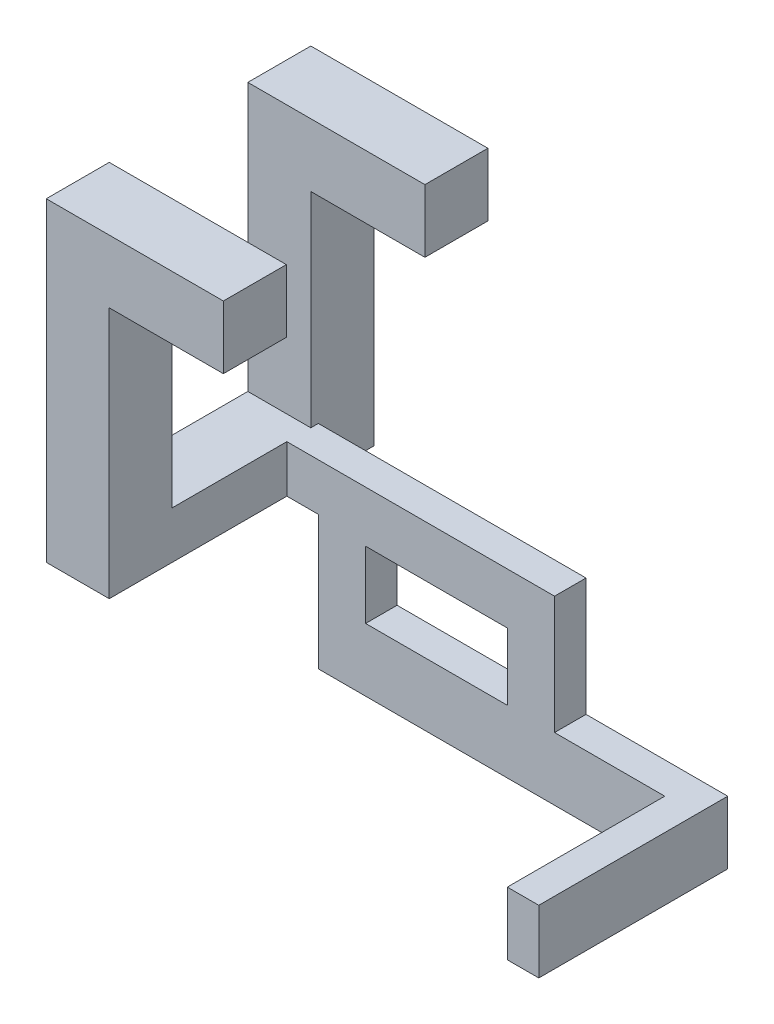
ISO-10303-21;
HEADER;
FILE_DESCRIPTION(('STEP AP214'),'2;1');
FILE_NAME('part.step','',(''),(''),'','','');
FILE_SCHEMA(('AUTOMOTIVE_DESIGN { 1 0 10303 214 1 1 1 1 }'));
ENDSEC;
DATA;
#1=APPLICATION_CONTEXT('core data for automotive mechanical design processes');
#2=APPLICATION_PROTOCOL_DEFINITION('international standard','automotive_design',2000,#1);
#3=PRODUCT_CONTEXT('',#1,'mechanical');
#4=PRODUCT('Part','Part','',(#3));
#5=PRODUCT_RELATED_PRODUCT_CATEGORY('part','',(#4));
#6=PRODUCT_DEFINITION_FORMATION('','',#4);
#7=PRODUCT_DEFINITION_CONTEXT('part definition',#1,'design');
#8=PRODUCT_DEFINITION('design','',#6,#7);
#9=PRODUCT_DEFINITION_SHAPE('','',#8);
#10=(LENGTH_UNIT() NAMED_UNIT(*) SI_UNIT(.MILLI.,.METRE.));
#11=(NAMED_UNIT(*) PLANE_ANGLE_UNIT() SI_UNIT($,.RADIAN.));
#12=(NAMED_UNIT(*) SI_UNIT($,.STERADIAN.) SOLID_ANGLE_UNIT());
#13=UNCERTAINTY_MEASURE_WITH_UNIT(LENGTH_MEASURE(1.E-05),#10,'distance_accuracy_value','');
#14=(GEOMETRIC_REPRESENTATION_CONTEXT(3) GLOBAL_UNCERTAINTY_ASSIGNED_CONTEXT((#13)) GLOBAL_UNIT_ASSIGNED_CONTEXT((#10,
#11,#12)) REPRESENTATION_CONTEXT('',''));
#15=CARTESIAN_POINT('',(0.,0.,0.));
#16=DIRECTION('',(0.,0.,1.));
#17=DIRECTION('',(1.,0.,0.));
#18=AXIS2_PLACEMENT_3D('',#15,#16,#17);
#19=CARTESIAN_POINT('',(-24.1300000000002,57.785,23.5700000000001));
#20=DIRECTION('',(0.,0.,-1.));
#21=DIRECTION('',(-0.999999999999999,0.,0.));
#22=AXIS2_PLACEMENT_3D('',#19,#20,#21);
#23=PLANE('',#22);
#24=DIRECTION('',(-0.999999999999999,0.,0.));
#25=VECTOR('',#24,1.);
#26=CARTESIAN_POINT('',(-29.2100000000002,14.605,23.5700000000001));
#27=LINE('',#26,#25);
#28=CARTESIAN_POINT('',(-24.1300000000001,14.6049999999999,23.5700000000001));
#29=VERTEX_POINT('',#28);
#30=CARTESIAN_POINT('',(-34.2900000000002,14.605,23.5700000000001));
#31=VERTEX_POINT('',#30);
#32=EDGE_CURVE('E55',#29,#31,#27,.T.);
#33=ORIENTED_EDGE('',*,*,#32,.T.);
#34=DIRECTION('',(0.,-1.,0.));
#35=VECTOR('',#34,1.);
#36=CARTESIAN_POINT('',(-34.29,57.785,23.5700000000001));
#37=LINE('',#36,#35);
#38=CARTESIAN_POINT('',(-34.29,57.785,23.5700000000001));
#39=VERTEX_POINT('',#38);
#40=EDGE_CURVE('E352',#39,#31,#37,.T.);
#41=ORIENTED_EDGE('',*,*,#40,.F.);
#42=DIRECTION('',(0.999999999999999,0.,0.));
#43=VECTOR('',#42,1.);
#44=CARTESIAN_POINT('',(-24.1300000000002,57.785,23.5700000000001));
#45=LINE('',#44,#43);
#46=CARTESIAN_POINT('',(-5.72109422320011,57.785,23.5700000000001));
#47=VERTEX_POINT('',#46);
#48=EDGE_CURVE('E343',#39,#47,#45,.T.);
#49=ORIENTED_EDGE('',*,*,#48,.T.);
#50=DIRECTION('',(0.,-1.,0.));
#51=VECTOR('',#50,1.);
#52=CARTESIAN_POINT('',(-5.72109422320011,57.785,23.5700000000001));
#53=LINE('',#52,#51);
#54=CARTESIAN_POINT('',(-5.72109422320013,47.625,23.5700000000001));
#55=VERTEX_POINT('',#54);
#56=EDGE_CURVE('E287',#47,#55,#53,.T.);
#57=ORIENTED_EDGE('',*,*,#56,.T.);
#58=DIRECTION('',(-0.999999999999999,0.,0.));
#59=VECTOR('',#58,1.);
#60=CARTESIAN_POINT('',(8.64731557051054,47.625,23.5700000000001));
#61=LINE('',#60,#59);
#62=CARTESIAN_POINT('',(-24.13,47.625,23.5700000000001));
#63=VERTEX_POINT('',#62);
#64=EDGE_CURVE('E300',#55,#63,#61,.T.);
#65=ORIENTED_EDGE('',*,*,#64,.T.);
#66=DIRECTION('',(0.,-1.,0.));
#67=VECTOR('',#66,1.);
#68=CARTESIAN_POINT('',(-24.1300000000002,57.785,23.5700000000001));
#69=LINE('',#68,#67);
#70=EDGE_CURVE('E349',#63,#29,#69,.T.);
#71=ORIENTED_EDGE('',*,*,#70,.T.);
#72=EDGE_LOOP('',(#33,#41,#49,#57,#65,#71));
#73=FACE_BOUND('',#72,.T.);
#74=ADVANCED_FACE('F40',(#73),#23,.T.);
#75=CARTESIAN_POINT('',(-24.13,57.785,1.218));
#76=DIRECTION('',(0.,0.,1.));
#77=DIRECTION('',(0.,-1.,0.));
#78=AXIS2_PLACEMENT_3D('',#75,#76,#77);
#79=PLANE('',#78);
#80=DIRECTION('',(0.,-1.,0.));
#81=VECTOR('',#80,1.);
#82=CARTESIAN_POINT('',(-34.2900000000001,57.785,1.21799999999999));
#83=LINE('',#82,#81);
#84=CARTESIAN_POINT('',(-34.2900000000001,57.785,1.21799999999999));
#85=VERTEX_POINT('',#84);
#86=CARTESIAN_POINT('',(-34.29,14.605,1.21799999999999));
#87=VERTEX_POINT('',#86);
#88=EDGE_CURVE('E311',#85,#87,#83,.T.);
#89=ORIENTED_EDGE('',*,*,#88,.T.);
#90=DIRECTION('',(-0.999999999999999,0.,0.));
#91=VECTOR('',#90,1.);
#92=CARTESIAN_POINT('',(19.05,14.605,1.218));
#93=LINE('',#92,#91);
#94=CARTESIAN_POINT('',(-24.1300000000002,14.605,1.21799999999999));
#95=VERTEX_POINT('',#94);
#96=EDGE_CURVE('E63',#95,#87,#93,.T.);
#97=ORIENTED_EDGE('',*,*,#96,.F.);
#98=DIRECTION('',(0.,-1.,0.));
#99=VECTOR('',#98,1.);
#100=CARTESIAN_POINT('',(-24.13,57.785,1.218));
#101=LINE('',#100,#99);
#102=CARTESIAN_POINT('',(-24.13,47.625,1.21799999999999));
#103=VERTEX_POINT('',#102);
#104=EDGE_CURVE('E308',#103,#95,#101,.T.);
#105=ORIENTED_EDGE('',*,*,#104,.F.);
#106=DIRECTION('',(-0.999999999999999,0.,0.));
#107=VECTOR('',#106,1.);
#108=CARTESIAN_POINT('',(8.64731557051068,47.625,1.21799999999999));
#109=LINE('',#108,#107);
#110=CARTESIAN_POINT('',(-5.7210942232,47.625,1.21799999999999));
#111=VERTEX_POINT('',#110);
#112=EDGE_CURVE('E269',#111,#103,#109,.T.);
#113=ORIENTED_EDGE('',*,*,#112,.F.);
#114=DIRECTION('',(0.,1.,0.));
#115=VECTOR('',#114,1.);
#116=CARTESIAN_POINT('',(-5.7210942232,57.785,1.21799999999999));
#117=LINE('',#116,#115);
#118=CARTESIAN_POINT('',(-5.7210942232,57.785,1.21799999999999));
#119=VERTEX_POINT('',#118);
#120=EDGE_CURVE('E265',#111,#119,#117,.T.);
#121=ORIENTED_EDGE('',*,*,#120,.T.);
#122=DIRECTION('',(-0.999999999999999,0.,0.));
#123=VECTOR('',#122,1.);
#124=CARTESIAN_POINT('',(-24.13,57.785,1.218));
#125=LINE('',#124,#123);
#126=EDGE_CURVE('E321',#119,#85,#125,.T.);
#127=ORIENTED_EDGE('',*,*,#126,.T.);
#128=EDGE_LOOP('',(#89,#97,#105,#113,#121,#127));
#129=FACE_BOUND('',#128,.T.);
#130=ADVANCED_FACE('F441',(#129),#79,.T.);
#131=CARTESIAN_POINT('',(-1.38777878078145E-13,0.,5.08));
#132=DIRECTION('',(0.,0.,1.));
#133=DIRECTION('',(0.999999999999999,0.,0.));
#134=AXIS2_PLACEMENT_3D('',#131,#132,#133);
#135=PLANE('',#134);
#136=DIRECTION('',(0.,1.,0.));
#137=VECTOR('',#136,1.);
#138=CARTESIAN_POINT('',(11.4299999999999,-6.34999999999999,5.08));
#139=LINE('',#138,#137);
#140=CARTESIAN_POINT('',(11.4299999999999,-4.44499999999995,5.08));
#141=VERTEX_POINT('',#140);
#142=CARTESIAN_POINT('',(11.4299999999999,6.35000000000005,5.08));
#143=VERTEX_POINT('',#142);
#144=EDGE_CURVE('E375',#141,#143,#139,.T.);
#145=ORIENTED_EDGE('',*,*,#144,.F.);
#146=DIRECTION('',(0.999999999999999,0.,0.));
#147=VECTOR('',#146,1.);
#148=CARTESIAN_POINT('',(-30.4092253256992,-4.445,5.08));
#149=LINE('',#148,#147);
#150=CARTESIAN_POINT('',(-11.4300000000001,-4.44500000000009,5.08));
#151=VERTEX_POINT('',#150);
#152=EDGE_CURVE('E257',#151,#141,#149,.T.);
#153=ORIENTED_EDGE('',*,*,#152,.F.);
#154=DIRECTION('',(0.,-1.,0.));
#155=VECTOR('',#154,1.);
#156=CARTESIAN_POINT('',(-11.4300000000001,-6.34999999999999,5.08));
#157=LINE('',#156,#155);
#158=CARTESIAN_POINT('',(-11.4300000000001,6.34999999999988,5.08));
#159=VERTEX_POINT('',#158);
#160=EDGE_CURVE('E379',#159,#151,#157,.T.);
#161=ORIENTED_EDGE('',*,*,#160,.F.);
#162=DIRECTION('',(-0.999999999999999,0.,0.));
#163=VECTOR('',#162,1.);
#164=CARTESIAN_POINT('',(-11.4300000000001,6.34999999999988,5.08));
#165=LINE('',#164,#163);
#166=EDGE_CURVE('E387',#143,#159,#165,.T.);
#167=ORIENTED_EDGE('',*,*,#166,.F.);
#168=EDGE_LOOP('',(#145,#153,#161,#167));
#169=FACE_BOUND('',#168,.T.);
#170=DIRECTION('',(-0.999999999999999,0.,0.));
#171=VECTOR('',#170,1.);
#172=CARTESIAN_POINT('',(19.0499999999999,-14.605,5.08000000000002));
#173=LINE('',#172,#171);
#174=CARTESIAN_POINT('',(36.8299999999999,-14.6050000000001,5.08));
#175=VERTEX_POINT('',#174);
#176=CARTESIAN_POINT('',(-19.05,-14.605,5.08));
#177=VERTEX_POINT('',#176);
#178=EDGE_CURVE('E403',#175,#177,#173,.T.);
#179=ORIENTED_EDGE('',*,*,#178,.F.);
#180=DIRECTION('',(0.,-1.,0.));
#181=VECTOR('',#180,1.);
#182=CARTESIAN_POINT('',(36.83,-4.44499999999998,5.07999999999999));
#183=LINE('',#182,#181);
#184=CARTESIAN_POINT('',(36.83,-4.44499999999998,5.07999999999999));
#185=VERTEX_POINT('',#184);
#186=EDGE_CURVE('E240',#185,#175,#183,.T.);
#187=ORIENTED_EDGE('',*,*,#186,.F.);
#188=CARTESIAN_POINT('',(19.0499999999998,-4.445,5.08));
#189=VERTEX_POINT('',#188);
#190=EDGE_CURVE('E255',#189,#185,#149,.T.);
#191=ORIENTED_EDGE('',*,*,#190,.F.);
#192=DIRECTION('',(0.,1.,0.));
#193=VECTOR('',#192,1.);
#194=CARTESIAN_POINT('',(19.0499999999999,-14.605,5.08000000000002));
#195=LINE('',#194,#193);
#196=CARTESIAN_POINT('',(19.0499999999997,14.605,5.08));
#197=VERTEX_POINT('',#196);
#198=EDGE_CURVE('E396',#189,#197,#195,.T.);
#199=ORIENTED_EDGE('',*,*,#198,.T.);
#200=DIRECTION('',(-0.999999999999999,0.,0.));
#201=VECTOR('',#200,1.);
#202=CARTESIAN_POINT('',(19.0499999999997,14.605,5.08));
#203=LINE('',#202,#201);
#204=CARTESIAN_POINT('',(-24.13,14.605,5.08));
#205=VERTEX_POINT('',#204);
#206=EDGE_CURVE('E398',#197,#205,#203,.T.);
#207=ORIENTED_EDGE('',*,*,#206,.T.);
#208=DIRECTION('',(0.,1.,0.));
#209=VECTOR('',#208,1.);
#210=CARTESIAN_POINT('',(-24.13,14.605,5.08));
#211=LINE('',#210,#209);
#212=CARTESIAN_POINT('',(-24.1300000000001,6.98499999999991,5.08));
#213=VERTEX_POINT('',#212);
#214=EDGE_CURVE('E357',#213,#205,#211,.T.);
#215=ORIENTED_EDGE('',*,*,#214,.F.);
#216=DIRECTION('',(0.999999999999999,0.,0.));
#217=VECTOR('',#216,1.);
#218=CARTESIAN_POINT('',(-29.2100000000002,6.98499999999999,5.08));
#219=LINE('',#218,#217);
#220=CARTESIAN_POINT('',(-19.05,6.98499999999999,5.08));
#221=VERTEX_POINT('',#220);
#222=EDGE_CURVE('E369',#213,#221,#219,.T.);
#223=ORIENTED_EDGE('',*,*,#222,.T.);
#224=DIRECTION('',(0.,1.,0.));
#225=VECTOR('',#224,1.);
#226=CARTESIAN_POINT('',(-19.05,-14.605,5.08));
#227=LINE('',#226,#225);
#228=EDGE_CURVE('E401',#177,#221,#227,.T.);
#229=ORIENTED_EDGE('',*,*,#228,.F.);
#230=EDGE_LOOP('',(#179,#187,#191,#199,#207,#215,#223,#229));
#231=FACE_BOUND('',#230,.T.);
#232=ADVANCED_FACE('F461',(#169,#231),#135,.T.);
#233=CARTESIAN_POINT('',(-24.13,57.785,1.218));
#234=DIRECTION('',(0.999999999999999,0.,0.));
#235=DIRECTION('',(0.,0.,-1.));
#236=AXIS2_PLACEMENT_3D('',#233,#234,#235);
#237=PLANE('',#236);
#238=DIRECTION('',(0.,-1.,0.));
#239=VECTOR('',#238,1.);
#240=CARTESIAN_POINT('',(-24.1299999999999,57.7849999999999,-8.94200000000005));
#241=LINE('',#240,#239);
#242=CARTESIAN_POINT('',(-24.1300000000001,47.625,-8.94200000000002));
#243=VERTEX_POINT('',#242);
#244=CARTESIAN_POINT('',(-24.1300000000001,6.98499999999988,-8.94200000000004));
#245=VERTEX_POINT('',#244);
#246=EDGE_CURVE('E297',#243,#245,#241,.T.);
#247=ORIENTED_EDGE('',*,*,#246,.F.);
#248=DIRECTION('',(0.,0.,-1.));
#249=VECTOR('',#248,1.);
#250=CARTESIAN_POINT('',(-24.13,47.625,1.21799999999998));
#251=LINE('',#250,#249);
#252=EDGE_CURVE('E276',#103,#243,#251,.T.);
#253=ORIENTED_EDGE('',*,*,#252,.F.);
#254=ORIENTED_EDGE('',*,*,#104,.T.);
#255=DIRECTION('',(0.,0.,1.));
#256=VECTOR('',#255,1.);
#257=CARTESIAN_POINT('',(-24.13,14.605,5.08));
#258=LINE('',#257,#256);
#259=CARTESIAN_POINT('',(-24.13,14.605,0.));
#260=VERTEX_POINT('',#259);
#261=EDGE_CURVE('E333',#260,#95,#258,.T.);
#262=ORIENTED_EDGE('',*,*,#261,.F.);
#263=DIRECTION('',(0.,1.,0.));
#264=VECTOR('',#263,1.);
#265=CARTESIAN_POINT('',(-24.13,0.,0.));
#266=LINE('',#265,#264);
#267=CARTESIAN_POINT('',(-24.1300000000002,6.98499999999991,0.));
#268=VERTEX_POINT('',#267);
#269=EDGE_CURVE('E331',#268,#260,#266,.T.);
#270=ORIENTED_EDGE('',*,*,#269,.F.);
#271=DIRECTION('',(0.,0.,1.));
#272=VECTOR('',#271,1.);
#273=CARTESIAN_POINT('',(-24.13,6.98499999999985,1.218));
#274=LINE('',#273,#272);
#275=EDGE_CURVE('E320',#245,#268,#274,.T.);
#276=ORIENTED_EDGE('',*,*,#275,.F.);
#277=EDGE_LOOP('',(#247,#253,#254,#262,#270,#276));
#278=FACE_BOUND('',#277,.T.);
#279=ADVANCED_FACE('F428',(#278),#237,.T.);
#280=CARTESIAN_POINT('',(-24.13,14.605,32.7281002396786));
#281=DIRECTION('',(-0.999999999999999,0.,0.));
#282=DIRECTION('',(0.,0.,1.));
#283=AXIS2_PLACEMENT_3D('',#280,#281,#282);
#284=PLANE('',#283);
#285=DIRECTION('',(0.,0.,-1.));
#286=VECTOR('',#285,1.);
#287=CARTESIAN_POINT('',(-24.13,47.625,33.7300000000001));
#288=LINE('',#287,#286);
#289=CARTESIAN_POINT('',(-24.13,47.625,33.7300000000001));
#290=VERTEX_POINT('',#289);
#291=EDGE_CURVE('E279',#290,#63,#288,.T.);
#292=ORIENTED_EDGE('',*,*,#291,.F.);
#293=DIRECTION('',(0.,-1.,0.));
#294=VECTOR('',#293,1.);
#295=CARTESIAN_POINT('',(-24.13,57.785,33.7300000000001));
#296=LINE('',#295,#294);
#297=CARTESIAN_POINT('',(-24.1300000000002,6.98500000000002,33.7300000000001));
#298=VERTEX_POINT('',#297);
#299=EDGE_CURVE('E345',#290,#298,#296,.T.);
#300=ORIENTED_EDGE('',*,*,#299,.T.);
#301=DIRECTION('',(0.,0.,-1.));
#302=VECTOR('',#301,1.);
#303=CARTESIAN_POINT('',(-24.1300000000001,6.98499999999999,32.7281002396786));
#304=LINE('',#303,#302);
#305=EDGE_CURVE('E351',#298,#213,#304,.T.);
#306=ORIENTED_EDGE('',*,*,#305,.T.);
#307=ORIENTED_EDGE('',*,*,#214,.T.);
#308=DIRECTION('',(0.,0.,-1.));
#309=VECTOR('',#308,1.);
#310=CARTESIAN_POINT('',(-24.13,14.605,32.7281002396786));
#311=LINE('',#310,#309);
#312=EDGE_CURVE('E360',#29,#205,#311,.T.);
#313=ORIENTED_EDGE('',*,*,#312,.F.);
#314=ORIENTED_EDGE('',*,*,#70,.F.);
#315=EDGE_LOOP('',(#292,#300,#306,#307,#313,#314));
#316=FACE_BOUND('',#315,.T.);
#317=ADVANCED_FACE('F456',(#316),#284,.F.);
#318=CARTESIAN_POINT('',(19.0499999999999,-14.605,5.08000000000002));
#319=DIRECTION('',(-0.999999999999999,0.,0.));
#320=DIRECTION('',(0.,0.,1.));
#321=AXIS2_PLACEMENT_3D('',#318,#319,#320);
#322=PLANE('',#321);
#323=ORIENTED_EDGE('',*,*,#198,.F.);
#324=DIRECTION('',(0.,0.,-1.));
#325=VECTOR('',#324,1.);
#326=CARTESIAN_POINT('',(19.0499999999998,-4.445,5.08));
#327=LINE('',#326,#325);
#328=CARTESIAN_POINT('',(19.0499999999999,-4.445,0.));
#329=VERTEX_POINT('',#328);
#330=EDGE_CURVE('E262',#189,#329,#327,.T.);
#331=ORIENTED_EDGE('',*,*,#330,.T.);
#332=DIRECTION('',(0.,1.,0.));
#333=VECTOR('',#332,1.);
#334=CARTESIAN_POINT('',(19.0499999999998,-14.605,0.));
#335=LINE('',#334,#333);
#336=CARTESIAN_POINT('',(19.05,14.605,0.));
#337=VERTEX_POINT('',#336);
#338=EDGE_CURVE('E393',#329,#337,#335,.T.);
#339=ORIENTED_EDGE('',*,*,#338,.T.);
#340=DIRECTION('',(0.,0.,-1.));
#341=VECTOR('',#340,1.);
#342=CARTESIAN_POINT('',(19.0499999999997,14.605,5.08));
#343=LINE('',#342,#341);
#344=EDGE_CURVE('E48',#197,#337,#343,.T.);
#345=ORIENTED_EDGE('',*,*,#344,.F.);
#346=EDGE_LOOP('',(#323,#331,#339,#345));
#347=FACE_BOUND('',#346,.T.);
#348=ADVANCED_FACE('F42',(#347),#322,.F.);
#349=CARTESIAN_POINT('',(19.0499999999997,14.605,5.08));
#350=DIRECTION('',(0.,-1.,0.));
#351=DIRECTION('',(0.999999999999999,0.,0.));
#352=AXIS2_PLACEMENT_3D('',#349,#350,#351);
#353=PLANE('',#352);
#354=DIRECTION('',(-0.999999999999999,0.,0.));
#355=VECTOR('',#354,1.);
#356=CARTESIAN_POINT('',(19.05,14.605,0.));
#357=LINE('',#356,#355);
#358=EDGE_CURVE('E407',#337,#260,#357,.T.);
#359=ORIENTED_EDGE('',*,*,#358,.T.);
#360=ORIENTED_EDGE('',*,*,#261,.T.);
#361=ORIENTED_EDGE('',*,*,#96,.T.);
#362=DIRECTION('',(0.,0.,-1.));
#363=VECTOR('',#362,1.);
#364=CARTESIAN_POINT('',(-34.29,14.605,1.21799999999999));
#365=LINE('',#364,#363);
#366=EDGE_CURVE('E242',#31,#87,#365,.T.);
#367=ORIENTED_EDGE('',*,*,#366,.F.);
#368=ORIENTED_EDGE('',*,*,#32,.F.);
#369=ORIENTED_EDGE('',*,*,#312,.T.);
#370=ORIENTED_EDGE('',*,*,#206,.F.);
#371=ORIENTED_EDGE('',*,*,#344,.T.);
#372=EDGE_LOOP('',(#359,#360,#361,#367,#368,#369,#370,#371));
#373=FACE_BOUND('',#372,.T.);
#374=ADVANCED_FACE('F417',(#373),#353,.F.);
#375=CARTESIAN_POINT('',(-19.05,-14.605,5.08));
#376=DIRECTION('',(-0.999999999999999,0.,0.));
#377=DIRECTION('',(0.,0.,1.));
#378=AXIS2_PLACEMENT_3D('',#375,#376,#377);
#379=PLANE('',#378);
#380=DIRECTION('',(0.,0.,1.));
#381=VECTOR('',#380,1.);
#382=CARTESIAN_POINT('',(-19.05,6.98499999999999,5.08));
#383=LINE('',#382,#381);
#384=CARTESIAN_POINT('',(-19.0500000000001,6.98499999999999,0.));
#385=VERTEX_POINT('',#384);
#386=EDGE_CURVE('E362',#385,#221,#383,.T.);
#387=ORIENTED_EDGE('',*,*,#386,.F.);
#388=DIRECTION('',(0.,1.,0.));
#389=VECTOR('',#388,1.);
#390=CARTESIAN_POINT('',(-19.0500000000001,-14.605,0.));
#391=LINE('',#390,#389);
#392=CARTESIAN_POINT('',(-19.0500000000001,-14.605,0.));
#393=VERTEX_POINT('',#392);
#394=EDGE_CURVE('E410',#393,#385,#391,.T.);
#395=ORIENTED_EDGE('',*,*,#394,.F.);
#396=DIRECTION('',(0.,0.,-1.));
#397=VECTOR('',#396,1.);
#398=CARTESIAN_POINT('',(-19.05,-14.605,5.08));
#399=LINE('',#398,#397);
#400=EDGE_CURVE('E405',#177,#393,#399,.T.);
#401=ORIENTED_EDGE('',*,*,#400,.F.);
#402=ORIENTED_EDGE('',*,*,#228,.T.);
#403=EDGE_LOOP('',(#387,#395,#401,#402));
#404=FACE_BOUND('',#403,.T.);
#405=ADVANCED_FACE('F466',(#404),#379,.T.);
#406=CARTESIAN_POINT('',(19.0499999999999,-14.605,5.08000000000002));
#407=DIRECTION('',(0.,-1.,0.));
#408=DIRECTION('',(0.999999999999999,0.,0.));
#409=AXIS2_PLACEMENT_3D('',#406,#407,#408);
#410=PLANE('',#409);
#411=DIRECTION('',(-0.999999999999999,0.,0.));
#412=VECTOR('',#411,1.);
#413=CARTESIAN_POINT('',(19.0499999999998,-14.605,0.));
#414=LINE('',#413,#412);
#415=CARTESIAN_POINT('',(41.9099999999998,-14.6050000000001,0.));
#416=VERTEX_POINT('',#415);
#417=EDGE_CURVE('E399',#416,#393,#414,.T.);
#418=ORIENTED_EDGE('',*,*,#417,.F.);
#419=DIRECTION('',(0.,0.,-1.));
#420=VECTOR('',#419,1.);
#421=CARTESIAN_POINT('',(41.9099999999999,-14.605,5.08));
#422=LINE('',#421,#420);
#423=CARTESIAN_POINT('',(41.91,-14.605,30.4800000000001));
#424=VERTEX_POINT('',#423);
#425=EDGE_CURVE('E252',#424,#416,#422,.T.);
#426=ORIENTED_EDGE('',*,*,#425,.F.);
#427=DIRECTION('',(0.999999999999999,0.,0.));
#428=VECTOR('',#427,1.);
#429=CARTESIAN_POINT('',(41.91,-14.605,30.4800000000001));
#430=LINE('',#429,#428);
#431=CARTESIAN_POINT('',(36.8299999999999,-14.605,30.4800000000001));
#432=VERTEX_POINT('',#431);
#433=EDGE_CURVE('E239',#432,#424,#430,.T.);
#434=ORIENTED_EDGE('',*,*,#433,.F.);
#435=DIRECTION('',(0.,0.,-1.));
#436=VECTOR('',#435,1.);
#437=CARTESIAN_POINT('',(36.8299999999999,-14.605,30.4800000000001));
#438=LINE('',#437,#436);
#439=EDGE_CURVE('E247',#432,#175,#438,.T.);
#440=ORIENTED_EDGE('',*,*,#439,.T.);
#441=ORIENTED_EDGE('',*,*,#178,.T.);
#442=ORIENTED_EDGE('',*,*,#400,.T.);
#443=EDGE_LOOP('',(#418,#426,#434,#440,#441,#442));
#444=FACE_BOUND('',#443,.T.);
#445=ADVANCED_FACE('F470',(#444),#410,.T.);
#446=CARTESIAN_POINT('',(0.,0.,0.));
#447=DIRECTION('',(0.,0.,1.));
#448=DIRECTION('',(0.999999999999999,0.,0.));
#449=AXIS2_PLACEMENT_3D('',#446,#447,#448);
#450=PLANE('',#449);
#451=DIRECTION('',(0.999999999999999,0.,0.));
#452=VECTOR('',#451,1.);
#453=CARTESIAN_POINT('',(-30.4092253256989,-4.44499999999998,0.));
#454=LINE('',#453,#452);
#455=CARTESIAN_POINT('',(-11.4300000000001,-4.445,0.));
#456=VERTEX_POINT('',#455);
#457=CARTESIAN_POINT('',(11.4299999999999,-4.445,0.));
#458=VERTEX_POINT('',#457);
#459=EDGE_CURVE('E258',#456,#458,#454,.T.);
#460=ORIENTED_EDGE('',*,*,#459,.T.);
#461=DIRECTION('',(0.,1.,0.));
#462=VECTOR('',#461,1.);
#463=CARTESIAN_POINT('',(11.4299999999999,-6.35000000000008,0.));
#464=LINE('',#463,#462);
#465=CARTESIAN_POINT('',(11.4299999999999,6.34999999999999,0.));
#466=VERTEX_POINT('',#465);
#467=EDGE_CURVE('E376',#458,#466,#464,.T.);
#468=ORIENTED_EDGE('',*,*,#467,.T.);
#469=DIRECTION('',(-0.999999999999999,0.,0.));
#470=VECTOR('',#469,1.);
#471=CARTESIAN_POINT('',(-11.4300000000001,6.34999999999999,0.));
#472=LINE('',#471,#470);
#473=CARTESIAN_POINT('',(-11.4300000000001,6.34999999999999,0.));
#474=VERTEX_POINT('',#473);
#475=EDGE_CURVE('E378',#466,#474,#472,.T.);
#476=ORIENTED_EDGE('',*,*,#475,.T.);
#477=DIRECTION('',(0.,-1.,0.));
#478=VECTOR('',#477,1.);
#479=CARTESIAN_POINT('',(-11.4300000000001,-6.34999999999999,0.));
#480=LINE('',#479,#478);
#481=EDGE_CURVE('E382',#474,#456,#480,.T.);
#482=ORIENTED_EDGE('',*,*,#481,.T.);
#483=EDGE_LOOP('',(#460,#468,#476,#482));
#484=FACE_BOUND('',#483,.T.);
#485=ORIENTED_EDGE('',*,*,#338,.F.);
#486=CARTESIAN_POINT('',(41.9099999999999,-4.445,0.));
#487=VERTEX_POINT('',#486);
#488=EDGE_CURVE('E224',#329,#487,#454,.T.);
#489=ORIENTED_EDGE('',*,*,#488,.T.);
#490=DIRECTION('',(0.,1.,0.));
#491=VECTOR('',#490,1.);
#492=CARTESIAN_POINT('',(41.9099999999999,-4.445,0.));
#493=LINE('',#492,#491);
#494=EDGE_CURVE('E222',#416,#487,#493,.T.);
#495=ORIENTED_EDGE('',*,*,#494,.F.);
#496=ORIENTED_EDGE('',*,*,#417,.T.);
#497=ORIENTED_EDGE('',*,*,#394,.T.);
#498=DIRECTION('',(0.999999999999999,0.,0.));
#499=VECTOR('',#498,1.);
#500=CARTESIAN_POINT('',(-29.21,6.98499999999999,0.));
#501=LINE('',#500,#499);
#502=EDGE_CURVE('E372',#268,#385,#501,.T.);
#503=ORIENTED_EDGE('',*,*,#502,.F.);
#504=ORIENTED_EDGE('',*,*,#269,.T.);
#505=ORIENTED_EDGE('',*,*,#358,.F.);
#506=EDGE_LOOP('',(#485,#489,#495,#496,#497,#503,#504,#505));
#507=FACE_BOUND('',#506,.T.);
#508=ADVANCED_FACE('F424',(#484,#507),#450,.F.);
#509=CARTESIAN_POINT('',(11.4299999999999,-6.35000000000008,0.));
#510=DIRECTION('',(0.999999999999999,0.,0.));
#511=DIRECTION('',(0.,0.,-1.));
#512=AXIS2_PLACEMENT_3D('',#509,#510,#511);
#513=PLANE('',#512);
#514=ORIENTED_EDGE('',*,*,#467,.F.);
#515=DIRECTION('',(0.,0.,1.));
#516=VECTOR('',#515,1.);
#517=CARTESIAN_POINT('',(11.4299999999999,-4.445,0.));
#518=LINE('',#517,#516);
#519=EDGE_CURVE('E260',#458,#141,#518,.T.);
#520=ORIENTED_EDGE('',*,*,#519,.T.);
#521=ORIENTED_EDGE('',*,*,#144,.T.);
#522=DIRECTION('',(0.,0.,1.));
#523=VECTOR('',#522,1.);
#524=CARTESIAN_POINT('',(11.4299999999999,6.34999999999999,0.));
#525=LINE('',#524,#523);
#526=EDGE_CURVE('E385',#466,#143,#525,.T.);
#527=ORIENTED_EDGE('',*,*,#526,.F.);
#528=EDGE_LOOP('',(#514,#520,#521,#527));
#529=FACE_BOUND('',#528,.T.);
#530=ADVANCED_FACE('F506',(#529),#513,.F.);
#531=CARTESIAN_POINT('',(-11.4300000000001,-6.34999999999999,0.));
#532=DIRECTION('',(-0.999999999999999,0.,0.));
#533=DIRECTION('',(0.,0.,1.));
#534=AXIS2_PLACEMENT_3D('',#531,#532,#533);
#535=PLANE('',#534);
#536=ORIENTED_EDGE('',*,*,#160,.T.);
#537=DIRECTION('',(0.,0.,-1.));
#538=VECTOR('',#537,1.);
#539=CARTESIAN_POINT('',(-11.4300000000001,-4.445,0.));
#540=LINE('',#539,#538);
#541=EDGE_CURVE('E11',#151,#456,#540,.T.);
#542=ORIENTED_EDGE('',*,*,#541,.T.);
#543=ORIENTED_EDGE('',*,*,#481,.F.);
#544=DIRECTION('',(0.,0.,1.));
#545=VECTOR('',#544,1.);
#546=CARTESIAN_POINT('',(-11.4300000000001,6.34999999999999,0.));
#547=LINE('',#546,#545);
#548=EDGE_CURVE('E391',#474,#159,#547,.T.);
#549=ORIENTED_EDGE('',*,*,#548,.T.);
#550=EDGE_LOOP('',(#536,#542,#543,#549));
#551=FACE_BOUND('',#550,.T.);
#552=ADVANCED_FACE('F503',(#551),#535,.F.);
#553=CARTESIAN_POINT('',(-11.4300000000001,6.34999999999999,0.));
#554=DIRECTION('',(0.,1.,0.));
#555=DIRECTION('',(0.,0.,1.));
#556=AXIS2_PLACEMENT_3D('',#553,#554,#555);
#557=PLANE('',#556);
#558=ORIENTED_EDGE('',*,*,#166,.T.);
#559=ORIENTED_EDGE('',*,*,#548,.F.);
#560=ORIENTED_EDGE('',*,*,#475,.F.);
#561=ORIENTED_EDGE('',*,*,#526,.T.);
#562=EDGE_LOOP('',(#558,#559,#560,#561));
#563=FACE_BOUND('',#562,.T.);
#564=ADVANCED_FACE('F502',(#563),#557,.F.);
#565=CARTESIAN_POINT('',(-29.2100000000002,6.98499999999999,5.08));
#566=DIRECTION('',(0.,1.,0.));
#567=DIRECTION('',(0.,0.,1.));
#568=AXIS2_PLACEMENT_3D('',#565,#566,#567);
#569=PLANE('',#568);
#570=ORIENTED_EDGE('',*,*,#275,.T.);
#571=ORIENTED_EDGE('',*,*,#502,.T.);
#572=ORIENTED_EDGE('',*,*,#386,.T.);
#573=ORIENTED_EDGE('',*,*,#222,.F.);
#574=ORIENTED_EDGE('',*,*,#305,.F.);
#575=DIRECTION('',(-0.999999999999999,0.,0.));
#576=VECTOR('',#575,1.);
#577=CARTESIAN_POINT('',(-24.1300000000002,6.98500000000002,33.7300000000001));
#578=LINE('',#577,#576);
#579=CARTESIAN_POINT('',(-34.2900000000002,6.98499999999999,33.7300000000001));
#580=VERTEX_POINT('',#579);
#581=EDGE_CURVE('E335',#298,#580,#578,.T.);
#582=ORIENTED_EDGE('',*,*,#581,.T.);
#583=DIRECTION('',(0.,0.,-1.));
#584=VECTOR('',#583,1.);
#585=CARTESIAN_POINT('',(-34.29,6.98499999999996,23.5700000000001));
#586=LINE('',#585,#584);
#587=CARTESIAN_POINT('',(-34.2900000000002,6.98499999999999,-8.94200000000004));
#588=VERTEX_POINT('',#587);
#589=EDGE_CURVE('E340',#580,#588,#586,.T.);
#590=ORIENTED_EDGE('',*,*,#589,.T.);
#591=DIRECTION('',(0.999999999999999,0.,0.));
#592=VECTOR('',#591,1.);
#593=CARTESIAN_POINT('',(-24.1300000000001,6.98499999999988,-8.94200000000004));
#594=LINE('',#593,#592);
#595=EDGE_CURVE('E317',#588,#245,#594,.T.);
#596=ORIENTED_EDGE('',*,*,#595,.T.);
#597=EDGE_LOOP('',(#570,#571,#572,#573,#574,#582,#590,#596));
#598=FACE_BOUND('',#597,.T.);
#599=ADVANCED_FACE('F430',(#598),#569,.F.);
#600=CARTESIAN_POINT('',(-34.29,57.785,23.5700000000001));
#601=DIRECTION('',(-0.999999999999999,0.,0.));
#602=DIRECTION('',(0.,0.,1.));
#603=AXIS2_PLACEMENT_3D('',#600,#601,#602);
#604=PLANE('',#603);
#605=ORIENTED_EDGE('',*,*,#589,.F.);
#606=DIRECTION('',(0.,-1.,0.));
#607=VECTOR('',#606,1.);
#608=CARTESIAN_POINT('',(-34.29,57.785,33.7300000000001));
#609=LINE('',#608,#607);
#610=CARTESIAN_POINT('',(-34.29,57.785,33.7300000000001));
#611=VERTEX_POINT('',#610);
#612=EDGE_CURVE('E354',#611,#580,#609,.T.);
#613=ORIENTED_EDGE('',*,*,#612,.F.);
#614=DIRECTION('',(0.,0.,-1.));
#615=VECTOR('',#614,1.);
#616=CARTESIAN_POINT('',(-34.29,57.785,23.5700000000001));
#617=LINE('',#616,#615);
#618=EDGE_CURVE('E339',#611,#39,#617,.T.);
#619=ORIENTED_EDGE('',*,*,#618,.T.);
#620=ORIENTED_EDGE('',*,*,#40,.T.);
#621=ORIENTED_EDGE('',*,*,#366,.T.);
#622=ORIENTED_EDGE('',*,*,#88,.F.);
#623=DIRECTION('',(0.,0.,-1.));
#624=VECTOR('',#623,1.);
#625=CARTESIAN_POINT('',(-34.2900000000001,57.785,1.21799999999999));
#626=LINE('',#625,#624);
#627=CARTESIAN_POINT('',(-34.29,57.785,-8.94200000000005));
#628=VERTEX_POINT('',#627);
#629=EDGE_CURVE('E325',#85,#628,#626,.T.);
#630=ORIENTED_EDGE('',*,*,#629,.T.);
#631=DIRECTION('',(0.,-1.,0.));
#632=VECTOR('',#631,1.);
#633=CARTESIAN_POINT('',(-34.29,57.785,-8.94200000000005));
#634=LINE('',#633,#632);
#635=EDGE_CURVE('E313',#628,#588,#634,.T.);
#636=ORIENTED_EDGE('',*,*,#635,.T.);
#637=EDGE_LOOP('',(#605,#613,#619,#620,#621,#622,#630,#636));
#638=FACE_BOUND('',#637,.T.);
#639=ADVANCED_FACE('F453',(#638),#604,.T.);
#640=CARTESIAN_POINT('',(-24.13,57.785,33.7300000000001));
#641=DIRECTION('',(0.,0.,1.));
#642=DIRECTION('',(0.,-1.,0.));
#643=AXIS2_PLACEMENT_3D('',#640,#641,#642);
#644=PLANE('',#643);
#645=ORIENTED_EDGE('',*,*,#581,.F.);
#646=ORIENTED_EDGE('',*,*,#299,.F.);
#647=DIRECTION('',(-0.999999999999999,0.,0.));
#648=VECTOR('',#647,1.);
#649=CARTESIAN_POINT('',(8.64731557051054,47.6249999999999,33.7300000000001));
#650=LINE('',#649,#648);
#651=CARTESIAN_POINT('',(-5.72109422320011,47.625,33.7300000000001));
#652=VERTEX_POINT('',#651);
#653=EDGE_CURVE('E303',#652,#290,#650,.T.);
#654=ORIENTED_EDGE('',*,*,#653,.F.);
#655=DIRECTION('',(0.,1.,0.));
#656=VECTOR('',#655,1.);
#657=CARTESIAN_POINT('',(-5.72109422320002,57.785,33.7300000000001));
#658=LINE('',#657,#656);
#659=CARTESIAN_POINT('',(-5.72109422320002,57.785,33.7300000000001));
#660=VERTEX_POINT('',#659);
#661=EDGE_CURVE('E294',#652,#660,#658,.T.);
#662=ORIENTED_EDGE('',*,*,#661,.T.);
#663=DIRECTION('',(-0.999999999999999,0.,0.));
#664=VECTOR('',#663,1.);
#665=CARTESIAN_POINT('',(-24.13,57.785,33.7300000000001));
#666=LINE('',#665,#664);
#667=EDGE_CURVE('E336',#660,#611,#666,.T.);
#668=ORIENTED_EDGE('',*,*,#667,.T.);
#669=ORIENTED_EDGE('',*,*,#612,.T.);
#670=EDGE_LOOP('',(#645,#646,#654,#662,#668,#669));
#671=FACE_BOUND('',#670,.T.);
#672=ADVANCED_FACE('F494',(#671),#644,.T.);
#673=CARTESIAN_POINT('',(0.,57.785,0.));
#674=DIRECTION('',(0.,-1.,0.));
#675=DIRECTION('',(0.,0.,-1.));
#676=AXIS2_PLACEMENT_3D('',#673,#674,#675);
#677=PLANE('',#676);
#678=ORIENTED_EDGE('',*,*,#667,.F.);
#679=DIRECTION('',(0.,0.,-1.));
#680=VECTOR('',#679,1.);
#681=CARTESIAN_POINT('',(-5.72109422320002,57.785,33.7300000000001));
#682=LINE('',#681,#680);
#683=EDGE_CURVE('E291',#660,#47,#682,.T.);
#684=ORIENTED_EDGE('',*,*,#683,.T.);
#685=ORIENTED_EDGE('',*,*,#48,.F.);
#686=ORIENTED_EDGE('',*,*,#618,.F.);
#687=EDGE_LOOP('',(#678,#684,#685,#686));
#688=FACE_BOUND('',#687,.T.);
#689=ADVANCED_FACE('F490',(#688),#677,.F.);
#690=CARTESIAN_POINT('',(-24.1299999999999,57.7849999999999,-8.94200000000005));
#691=DIRECTION('',(0.,0.,-1.));
#692=DIRECTION('',(0.,1.,0.));
#693=AXIS2_PLACEMENT_3D('',#690,#691,#692);
#694=PLANE('',#693);
#695=ORIENTED_EDGE('',*,*,#595,.F.);
#696=ORIENTED_EDGE('',*,*,#635,.F.);
#697=DIRECTION('',(0.999999999999999,0.,0.));
#698=VECTOR('',#697,1.);
#699=CARTESIAN_POINT('',(-24.1299999999999,57.7849999999999,-8.94200000000005));
#700=LINE('',#699,#698);
#701=CARTESIAN_POINT('',(-5.72109422320013,57.785,-8.94200000000005));
#702=VERTEX_POINT('',#701);
#703=EDGE_CURVE('E310',#628,#702,#700,.T.);
#704=ORIENTED_EDGE('',*,*,#703,.T.);
#705=DIRECTION('',(0.,-1.,0.));
#706=VECTOR('',#705,1.);
#707=CARTESIAN_POINT('',(-5.72109422320013,57.785,-8.94200000000005));
#708=LINE('',#707,#706);
#709=CARTESIAN_POINT('',(-5.7210942232,47.625,-8.94200000000005));
#710=VERTEX_POINT('',#709);
#711=EDGE_CURVE('E270',#702,#710,#708,.T.);
#712=ORIENTED_EDGE('',*,*,#711,.T.);
#713=DIRECTION('',(-0.999999999999999,0.,0.));
#714=VECTOR('',#713,1.);
#715=CARTESIAN_POINT('',(8.64731557051054,47.625,-8.94200000000002));
#716=LINE('',#715,#714);
#717=EDGE_CURVE('E273',#710,#243,#716,.T.);
#718=ORIENTED_EDGE('',*,*,#717,.T.);
#719=ORIENTED_EDGE('',*,*,#246,.T.);
#720=EDGE_LOOP('',(#695,#696,#704,#712,#718,#719));
#721=FACE_BOUND('',#720,.T.);
#722=ADVANCED_FACE('F435',(#721),#694,.T.);
#723=CARTESIAN_POINT('',(0.,57.785,0.));
#724=DIRECTION('',(0.,1.,0.));
#725=DIRECTION('',(0.,0.,1.));
#726=AXIS2_PLACEMENT_3D('',#723,#724,#725);
#727=PLANE('',#726);
#728=ORIENTED_EDGE('',*,*,#126,.F.);
#729=DIRECTION('',(0.,0.,-1.));
#730=VECTOR('',#729,1.);
#731=CARTESIAN_POINT('',(-5.7210942232,57.785,1.21799999999999));
#732=LINE('',#731,#730);
#733=EDGE_CURVE('E266',#119,#702,#732,.T.);
#734=ORIENTED_EDGE('',*,*,#733,.T.);
#735=ORIENTED_EDGE('',*,*,#703,.F.);
#736=ORIENTED_EDGE('',*,*,#629,.F.);
#737=EDGE_LOOP('',(#728,#734,#735,#736));
#738=FACE_BOUND('',#737,.T.);
#739=ADVANCED_FACE('F450',(#738),#727,.T.);
#740=CARTESIAN_POINT('',(8.64731557051054,47.6249999999999,33.7300000000001));
#741=DIRECTION('',(0.,1.,0.));
#742=DIRECTION('',(0.,0.,1.));
#743=AXIS2_PLACEMENT_3D('',#740,#741,#742);
#744=PLANE('',#743);
#745=ORIENTED_EDGE('',*,*,#64,.F.);
#746=DIRECTION('',(0.,0.,1.));
#747=VECTOR('',#746,1.);
#748=CARTESIAN_POINT('',(-5.72109422320011,47.625,33.7300000000001));
#749=LINE('',#748,#747);
#750=EDGE_CURVE('E290',#55,#652,#749,.T.);
#751=ORIENTED_EDGE('',*,*,#750,.T.);
#752=ORIENTED_EDGE('',*,*,#653,.T.);
#753=ORIENTED_EDGE('',*,*,#291,.T.);
#754=EDGE_LOOP('',(#745,#751,#752,#753));
#755=FACE_BOUND('',#754,.T.);
#756=ADVANCED_FACE('F634',(#755),#744,.F.);
#757=CARTESIAN_POINT('',(-5.7210942232,43.1588326304541,18.7585735629072));
#758=DIRECTION('',(-0.999999999999999,0.,0.));
#759=DIRECTION('',(0.,1.,0.));
#760=AXIS2_PLACEMENT_3D('',#757,#758,#759);
#761=PLANE('',#760);
#762=ORIENTED_EDGE('',*,*,#750,.F.);
#763=ORIENTED_EDGE('',*,*,#56,.F.);
#764=ORIENTED_EDGE('',*,*,#683,.F.);
#765=ORIENTED_EDGE('',*,*,#661,.F.);
#766=EDGE_LOOP('',(#762,#763,#764,#765));
#767=FACE_BOUND('',#766,.T.);
#768=ADVANCED_FACE('F625',(#767),#761,.F.);
#769=CARTESIAN_POINT('',(8.64731557051068,47.625,1.21799999999999));
#770=DIRECTION('',(0.,1.,0.));
#771=DIRECTION('',(0.,0.,1.));
#772=AXIS2_PLACEMENT_3D('',#769,#770,#771);
#773=PLANE('',#772);
#774=ORIENTED_EDGE('',*,*,#717,.F.);
#775=DIRECTION('',(0.,0.,1.));
#776=VECTOR('',#775,1.);
#777=CARTESIAN_POINT('',(-5.7210942232,47.625,1.21799999999999));
#778=LINE('',#777,#776);
#779=EDGE_CURVE('E282',#710,#111,#778,.T.);
#780=ORIENTED_EDGE('',*,*,#779,.T.);
#781=ORIENTED_EDGE('',*,*,#112,.T.);
#782=ORIENTED_EDGE('',*,*,#252,.T.);
#783=EDGE_LOOP('',(#774,#780,#781,#782));
#784=FACE_BOUND('',#783,.T.);
#785=ADVANCED_FACE('F442',(#784),#773,.F.);
#786=CARTESIAN_POINT('',(-5.7210942232,43.1588326304541,18.7585735629072));
#787=DIRECTION('',(-0.999999999999999,0.,0.));
#788=DIRECTION('',(0.,1.,0.));
#789=AXIS2_PLACEMENT_3D('',#786,#787,#788);
#790=PLANE('',#789);
#791=ORIENTED_EDGE('',*,*,#779,.F.);
#792=ORIENTED_EDGE('',*,*,#711,.F.);
#793=ORIENTED_EDGE('',*,*,#733,.F.);
#794=ORIENTED_EDGE('',*,*,#120,.F.);
#795=EDGE_LOOP('',(#791,#792,#793,#794));
#796=FACE_BOUND('',#795,.T.);
#797=ADVANCED_FACE('F445',(#796),#790,.F.);
#798=CARTESIAN_POINT('',(-30.4092253256992,-4.445,5.08));
#799=DIRECTION('',(0.,1.,0.));
#800=DIRECTION('',(0.,0.,1.));
#801=AXIS2_PLACEMENT_3D('',#798,#799,#800);
#802=PLANE('',#801);
#803=ORIENTED_EDGE('',*,*,#519,.F.);
#804=ORIENTED_EDGE('',*,*,#459,.F.);
#805=ORIENTED_EDGE('',*,*,#541,.F.);
#806=ORIENTED_EDGE('',*,*,#152,.T.);
#807=EDGE_LOOP('',(#803,#804,#805,#806));
#808=FACE_BOUND('',#807,.T.);
#809=ADVANCED_FACE('F598',(#808),#802,.T.);
#810=ORIENTED_EDGE('',*,*,#330,.F.);
#811=ORIENTED_EDGE('',*,*,#190,.T.);
#812=DIRECTION('',(0.,0.,-1.));
#813=VECTOR('',#812,1.);
#814=CARTESIAN_POINT('',(36.8299999999999,-4.445,30.4800000000001));
#815=LINE('',#814,#813);
#816=CARTESIAN_POINT('',(36.8299999999999,-4.445,30.4800000000001));
#817=VERTEX_POINT('',#816);
#818=EDGE_CURVE('E231',#817,#185,#815,.T.);
#819=ORIENTED_EDGE('',*,*,#818,.F.);
#820=DIRECTION('',(-0.999999999999999,0.,0.));
#821=VECTOR('',#820,1.);
#822=CARTESIAN_POINT('',(41.91,-4.445,30.4800000000001));
#823=LINE('',#822,#821);
#824=CARTESIAN_POINT('',(41.91,-4.445,30.4800000000001));
#825=VERTEX_POINT('',#824);
#826=EDGE_CURVE('E227',#825,#817,#823,.T.);
#827=ORIENTED_EDGE('',*,*,#826,.F.);
#828=DIRECTION('',(0.,0.,1.));
#829=VECTOR('',#828,1.);
#830=CARTESIAN_POINT('',(41.9099999999999,-4.44500000000012,5.08));
#831=LINE('',#830,#829);
#832=EDGE_CURVE('E215',#487,#825,#831,.T.);
#833=ORIENTED_EDGE('',*,*,#832,.F.);
#834=ORIENTED_EDGE('',*,*,#488,.F.);
#835=EDGE_LOOP('',(#810,#811,#819,#827,#833,#834));
#836=FACE_BOUND('',#835,.T.);
#837=ADVANCED_FACE('F229',(#836),#802,.T.);
#838=CARTESIAN_POINT('',(41.9099999999999,-1.11022302462516E-13,0.));
#839=DIRECTION('',(0.999999999999999,0.,0.));
#840=DIRECTION('',(0.,0.,-1.));
#841=AXIS2_PLACEMENT_3D('',#838,#839,#840);
#842=PLANE('',#841);
#843=ORIENTED_EDGE('',*,*,#832,.T.);
#844=DIRECTION('',(0.,1.,0.));
#845=VECTOR('',#844,1.);
#846=CARTESIAN_POINT('',(41.91,-4.445,30.4800000000001));
#847=LINE('',#846,#845);
#848=EDGE_CURVE('E220',#424,#825,#847,.T.);
#849=ORIENTED_EDGE('',*,*,#848,.F.);
#850=ORIENTED_EDGE('',*,*,#425,.T.);
#851=ORIENTED_EDGE('',*,*,#494,.T.);
#852=EDGE_LOOP('',(#843,#849,#850,#851));
#853=FACE_BOUND('',#852,.T.);
#854=ADVANCED_FACE('F217',(#853),#842,.T.);
#855=CARTESIAN_POINT('',(36.8299999999999,-4.445,30.4800000000001));
#856=DIRECTION('',(0.999999999999999,0.,0.));
#857=DIRECTION('',(0.,0.,-1.));
#858=AXIS2_PLACEMENT_3D('',#855,#856,#857);
#859=PLANE('',#858);
#860=ORIENTED_EDGE('',*,*,#186,.T.);
#861=ORIENTED_EDGE('',*,*,#439,.F.);
#862=DIRECTION('',(0.,-1.,0.));
#863=VECTOR('',#862,1.);
#864=CARTESIAN_POINT('',(36.8299999999999,-4.445,30.4800000000001));
#865=LINE('',#864,#863);
#866=EDGE_CURVE('E234',#817,#432,#865,.T.);
#867=ORIENTED_EDGE('',*,*,#866,.F.);
#868=ORIENTED_EDGE('',*,*,#818,.T.);
#869=EDGE_LOOP('',(#860,#861,#867,#868));
#870=FACE_BOUND('',#869,.T.);
#871=ADVANCED_FACE('F473',(#870),#859,.F.);
#872=CARTESIAN_POINT('',(0.,0.,30.4800000000001));
#873=DIRECTION('',(0.,0.,-1.));
#874=DIRECTION('',(-0.999999999999999,0.,0.));
#875=AXIS2_PLACEMENT_3D('',#872,#873,#874);
#876=PLANE('',#875);
#877=ORIENTED_EDGE('',*,*,#848,.T.);
#878=ORIENTED_EDGE('',*,*,#826,.T.);
#879=ORIENTED_EDGE('',*,*,#866,.T.);
#880=ORIENTED_EDGE('',*,*,#433,.T.);
#881=EDGE_LOOP('',(#877,#878,#879,#880));
#882=FACE_BOUND('',#881,.T.);
#883=ADVANCED_FACE('F237',(#882),#876,.F.);
#884=CLOSED_SHELL('',(#74,#130,#232,#279,#317,#348,#374,#405,#445,#508,#530,#552,#564,#599,#639,
#672,#689,#722,#739,#756,#768,#785,#797,#809,#837,#854,#871,#883));
#885=MANIFOLD_SOLID_BREP('B2',#884);
#886=ADVANCED_BREP_SHAPE_REPRESENTATION('',(#18,#885),#14);
#887=SHAPE_DEFINITION_REPRESENTATION(#9,#886);
ENDSEC;
END-ISO-10303-21;
